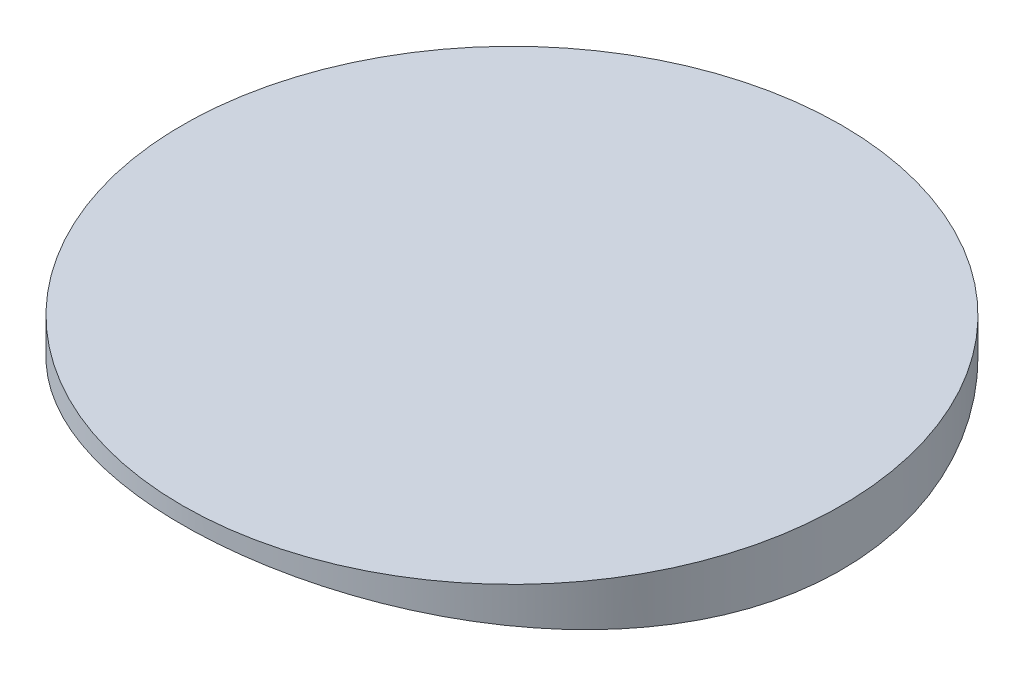
ISO-10303-21;
HEADER;
FILE_DESCRIPTION(('STEP AP214'),'2;1');
FILE_NAME('part.step','',(''),(''),'','','');
FILE_SCHEMA(('AUTOMOTIVE_DESIGN { 1 0 10303 214 1 1 1 1 }'));
ENDSEC;
DATA;
#1=APPLICATION_CONTEXT('core data for automotive mechanical design processes');
#2=APPLICATION_PROTOCOL_DEFINITION('international standard','automotive_design',2000,#1);
#3=PRODUCT_CONTEXT('',#1,'mechanical');
#4=PRODUCT('Part','Part','',(#3));
#5=PRODUCT_RELATED_PRODUCT_CATEGORY('part','',(#4));
#6=PRODUCT_DEFINITION_FORMATION('','',#4);
#7=PRODUCT_DEFINITION_CONTEXT('part definition',#1,'design');
#8=PRODUCT_DEFINITION('design','',#6,#7);
#9=PRODUCT_DEFINITION_SHAPE('','',#8);
#10=(LENGTH_UNIT() NAMED_UNIT(*) SI_UNIT(.MILLI.,.METRE.));
#11=(NAMED_UNIT(*) PLANE_ANGLE_UNIT() SI_UNIT($,.RADIAN.));
#12=(NAMED_UNIT(*) SI_UNIT($,.STERADIAN.) SOLID_ANGLE_UNIT());
#13=UNCERTAINTY_MEASURE_WITH_UNIT(LENGTH_MEASURE(1.E-05),#10,'distance_accuracy_value','');
#14=(GEOMETRIC_REPRESENTATION_CONTEXT(3) GLOBAL_UNCERTAINTY_ASSIGNED_CONTEXT((#13)) GLOBAL_UNIT_ASSIGNED_CONTEXT((#10,
#11,#12)) REPRESENTATION_CONTEXT('',''));
#15=CARTESIAN_POINT('',(0.,0.,0.));
#16=DIRECTION('',(0.,0.,1.));
#17=DIRECTION('',(1.,0.,0.));
#18=AXIS2_PLACEMENT_3D('',#15,#16,#17);
#19=CARTESIAN_POINT('',(0.,3.,0.));
#20=DIRECTION('',(0.,-1.,0.));
#21=DIRECTION('',(0.,0.,-1.));
#22=AXIS2_PLACEMENT_3D('',#19,#20,#21);
#23=CYLINDRICAL_SURFACE('',#22,17.75);
#24=CARTESIAN_POINT('',(0.,3.,0.));
#25=DIRECTION('',(0.,1.,0.));
#26=DIRECTION('',(0.,0.,1.));
#27=AXIS2_PLACEMENT_3D('',#24,#25,#26);
#28=CIRCLE('',#27,17.75);
#29=CARTESIAN_POINT('',(0.,3.,17.75));
#30=VERTEX_POINT('',#29);
#31=EDGE_CURVE('E10',#30,#30,#28,.T.);
#32=ORIENTED_EDGE('',*,*,#31,.F.);
#33=EDGE_LOOP('',(#32));
#34=FACE_BOUND('',#33,.T.);
#35=CARTESIAN_POINT('',(0.,2.09900340000001,-17.75));
#36=CARTESIAN_POINT('',(-0.491433900149807,2.09900216764836,-17.7499976735267));
#37=CARTESIAN_POINT('',(-0.982916530020127,2.09423107636766,-17.7295736278928));
#38=CARTESIAN_POINT('',(-1.96234996583072,2.07527570058066,-17.6480380111809));
#39=CARTESIAN_POINT('',(-2.45030028998495,2.06109015557167,-17.5869209917107));
#40=CARTESIAN_POINT('',(-3.41940177394618,2.02368989482152,-17.4244571266966));
#41=CARTESIAN_POINT('',(-3.90054879720632,2.00046991159636,-17.3230868109586));
#42=CARTESIAN_POINT('',(-4.85231153464607,1.94564459455475,-17.0809454528712));
#43=CARTESIAN_POINT('',(-5.32292757383714,1.91403951991046,-16.9401756283017));
#44=CARTESIAN_POINT('',(-6.24985270312643,1.84335168829396,-16.6205269411813));
#45=CARTESIAN_POINT('',(-6.70617729663108,1.80427738582975,-16.4416911402271));
#46=CARTESIAN_POINT('',(-7.60198717767945,1.71968899852689,-16.0471750969346));
#47=CARTESIAN_POINT('',(-8.04147235305884,1.6741748708032,-15.8314946092328));
#48=CARTESIAN_POINT('',(-8.90068545174085,1.57793364867855,-15.3648719887984));
#49=CARTESIAN_POINT('',(-9.32041393782313,1.52720670289864,-15.1139308612962));
#50=CARTESIAN_POINT('',(-10.1374139203251,1.42189460263339,-14.5785418387483));
#51=CARTESIAN_POINT('',(-10.5346851530274,1.36730940285718,-14.2940935503459));
#52=CARTESIAN_POINT('',(-11.3104852629579,1.2548274918673,-13.6887331865767));
#53=CARTESIAN_POINT('',(-11.6886049550004,1.19689139622589,-13.3673039297935));
#54=CARTESIAN_POINT('',(-12.4165458544308,1.08012824461524,-12.6940027230726));
#55=CARTESIAN_POINT('',(-12.7663667635571,1.02130117926317,-12.3421304523543));
#56=CARTESIAN_POINT('',(-13.4354239092553,0.904375385511255,-11.6102424058781));
#57=CARTESIAN_POINT('',(-13.7546572246536,0.846276727135264,-11.2302239482378));
#58=CARTESIAN_POINT('',(-14.3603444028004,0.732432965927232,-10.4445697875346));
#59=CARTESIAN_POINT('',(-14.6467981131199,0.676687874040308,-10.0389339653616));
#60=CARTESIAN_POINT('',(-15.188367787763,0.568439107945737,-9.19938497248016));
#61=CARTESIAN_POINT('',(-15.4430370092412,0.51598589868933,-8.76517691917405));
#62=CARTESIAN_POINT('',(-15.9148148725485,0.416654611871211,-7.87619097411225));
#63=CARTESIAN_POINT('',(-16.1319231064494,0.369776594860179,-7.42141285902461));
#64=CARTESIAN_POINT('',(-16.5268708929953,0.283008692213464,-6.49451953898693));
#65=CARTESIAN_POINT('',(-16.7047146407065,0.243118060131117,-6.0224061924467));
#66=CARTESIAN_POINT('',(-17.0197180237242,0.171540883470517,-5.06419118740278));
#67=CARTESIAN_POINT('',(-17.1568784989862,0.139854169514145,-4.57808981792613));
#68=CARTESIAN_POINT('',(-17.3873182193572,0.0861475192261473,-3.60411964396003));
#69=CARTESIAN_POINT('',(-17.4813264012814,0.0639674568930192,-3.11643209307797));
#70=CARTESIAN_POINT('',(-17.6281750476379,0.0291537101444027,-2.1345590522743));
#71=CARTESIAN_POINT('',(-17.6810159490135,0.0165199244062199,-1.64037363137671));
#72=CARTESIAN_POINT('',(-17.7450728039905,0.00118903335769042,-0.64921927293159));
#73=CARTESIAN_POINT('',(-17.7562938720456,-0.0015092928714472,-0.152250684910939));
#74=CARTESIAN_POINT('',(-17.7370275045556,0.00311107910149189,0.840827229290685));
#75=CARTESIAN_POINT('',(-17.7065405630266,0.0104296586570035,1.33693656557949));
#76=CARTESIAN_POINT('',(-17.6051967988499,0.0346007455670888,2.31427032458148));
#77=CARTESIAN_POINT('',(-17.5351978449678,0.0512506029542355,2.79558902086399));
#78=CARTESIAN_POINT('',(-17.356047717212,0.0934435532081054,3.75047721159731));
#79=CARTESIAN_POINT('',(-17.2468971714127,0.11898650341059,4.22404683023233));
#80=CARTESIAN_POINT('',(-16.990306447618,0.178224205932272,5.16018933207915));
#81=CARTESIAN_POINT('',(-16.842864616146,0.211919310269738,5.62276173947267));
#82=CARTESIAN_POINT('',(-16.5108254212522,0.286496085513679,6.5337739878395));
#83=CARTESIAN_POINT('',(-16.3262275436187,0.327377855877206,6.98221363312667));
#84=CARTESIAN_POINT('',(-15.9194321636609,0.415569784932033,7.86593267265295));
#85=CARTESIAN_POINT('',(-15.6969140546285,0.462934016390518,8.30105905479601));
#86=CARTESIAN_POINT('',(-15.2170464414502,0.562476437364064,9.15107681583447));
#87=CARTESIAN_POINT('',(-14.9596968203912,0.614654643037208,9.56596812680379));
#88=CARTESIAN_POINT('',(-14.4119082445781,0.722391963270564,10.3729088704726));
#89=CARTESIAN_POINT('',(-14.1214650291084,0.777951512740167,10.7649553521159));
#90=CARTESIAN_POINT('',(-13.5094502159222,0.890935946806646,11.5236633292259));
#91=CARTESIAN_POINT('',(-13.1878780984807,0.948360862536842,11.8903244006851));
#92=CARTESIAN_POINT('',(-12.5073761983231,1.06495839345886,12.6046557214652));
#93=CARTESIAN_POINT('',(-12.1477194799853,1.12413912269436,12.9516325283418));
#94=CARTESIAN_POINT('',(-11.4003136925216,1.24118503667594,13.614137434276));
#95=CARTESIAN_POINT('',(-11.0125641455423,1.29905019902247,13.9296649981712));
#96=CARTESIAN_POINT('',(-10.21154636885,1.4118529634241,14.5270940034082));
#97=CARTESIAN_POINT('',(-9.79827734449714,1.46679047421699,14.8089943968458));
#98=CARTESIAN_POINT('',(-8.94900716528595,1.57220189285851,15.3371384149977));
#99=CARTESIAN_POINT('',(-8.51300613769362,1.6226758256924,15.5833822393074));
#100=CARTESIAN_POINT('',(-7.62003411678745,1.71787294989165,16.0389992956327));
#101=CARTESIAN_POINT('',(-7.16300958467495,1.76258021447601,16.2482709801026));
#102=CARTESIAN_POINT('',(-6.23229289030544,1.84481241094844,16.6274932179164));
#103=CARTESIAN_POINT('',(-5.75860065038419,1.88233730936459,16.7974435880123));
#104=CARTESIAN_POINT('',(-4.79802252990442,1.94912333554688,17.0966223681426));
#105=CARTESIAN_POINT('',(-4.3111384407196,1.97838557922897,17.2258562774271));
#106=CARTESIAN_POINT('',(-3.32770801065407,2.02780529153385,17.4425446792502));
#107=CARTESIAN_POINT('',(-2.83116187559363,2.04796295388086,17.5300000607406));
#108=CARTESIAN_POINT('',(-1.84336341113391,2.07824287060055,17.6608928087894));
#109=CARTESIAN_POINT('',(-1.35224264681857,2.08858034118735,17.7052746569209));
#110=CARTESIAN_POINT('',(-0.367906250349285,2.09970567450912,17.7530260323656));
#111=CARTESIAN_POINT('',(0.125309350362291,2.10049368007329,17.7563961730815));
#112=CARTESIAN_POINT('',(1.11019580690158,2.09249834282815,17.7220976930214));
#113=CARTESIAN_POINT('',(1.60186677134417,2.08371568882763,17.6844320256287));
#114=CARTESIAN_POINT('',(2.58011896674844,2.05682623914264,17.5683833979145));
#115=CARTESIAN_POINT('',(3.06670021371209,2.03871947278199,17.4900005656463));
#116=CARTESIAN_POINT('',(4.0251400500618,1.99397362641447,17.2944189414568));
#117=CARTESIAN_POINT('',(4.49710712575665,1.96744578635822,17.1777255691075));
#118=CARTESIAN_POINT('',(5.4294091578802,1.90651129474908,16.906204287508));
#119=CARTESIAN_POINT('',(5.88974424324669,1.87210473057252,16.7513768011699));
#120=CARTESIAN_POINT('',(6.7957169196328,1.79633120484515,16.4047549860318));
#121=CARTESIAN_POINT('',(7.24135350220204,1.75496376689853,16.2129581269511));
#122=CARTESIAN_POINT('',(8.11497297605027,1.6663676415048,15.7938104867917));
#123=CARTESIAN_POINT('',(8.54295557626,1.61913885747044,15.5664591198056));
#124=CARTESIAN_POINT('',(9.38514951868315,1.51927647263005,15.0739244720486));
#125=CARTESIAN_POINT('',(9.79903441217586,1.46656897678928,14.8081979374125));
#126=CARTESIAN_POINT('',(10.6030483685396,1.35781156242898,14.2435665220657));
#127=CARTESIAN_POINT('',(10.9931772223102,1.30176161449779,13.9446613493822));
#128=CARTESIAN_POINT('',(11.7472128682115,1.18782187710542,13.3156515346542));
#129=CARTESIAN_POINT('',(12.1111162400325,1.12993184907588,12.9855428359979));
#130=CARTESIAN_POINT('',(12.8102991608037,1.01388091999327,12.2963292153186));
#131=CARTESIAN_POINT('',(13.1455783558417,0.955720015600431,11.9372239348858));
#132=CARTESIAN_POINT('',(13.7921001971144,0.839488085783322,11.1844451621414));
#133=CARTESIAN_POINT('',(14.1026834068092,0.78144505044432,10.7902006380142));
#134=CARTESIAN_POINT('',(14.6895477762945,0.668384815466029,9.97653775535923));
#135=CARTESIAN_POINT('',(14.9658283938089,0.613367663669389,9.55711899901743));
#136=CARTESIAN_POINT('',(15.4820822352393,0.507959686318647,8.69595576459424));
#137=CARTESIAN_POINT('',(15.7220563935648,0.45756874171423,8.25421186147959));
#138=CARTESIAN_POINT('',(16.1638964262227,0.36290277943039,7.35142855391276));
#139=CARTESIAN_POINT('',(16.3657627809909,0.318627684648636,6.8903893928108));
#140=CARTESIAN_POINT('',(16.7287252351005,0.237767825572588,5.95503282114152));
#141=CARTESIAN_POINT('',(16.8900554647576,0.201139115127992,5.48081009995816));
#142=CARTESIAN_POINT('',(17.1721833857345,0.136356279049456,4.51988410054988));
#143=CARTESIAN_POINT('',(17.2929811454144,0.108202139122733,4.03318084337549));
#144=CARTESIAN_POINT('',(17.4930113174778,0.0612415841082216,3.05093719476239));
#145=CARTESIAN_POINT('',(17.572250206947,0.0424337123980309,2.55539819285864));
#146=CARTESIAN_POINT('',(17.6885033907786,0.0147479030372739,1.55911948495265));
#147=CARTESIAN_POINT('',(17.7255185440558,0.00586976339631195,1.05837988494999));
#148=CARTESIAN_POINT('',(17.7566096827731,-0.00158414836056286,0.0680002453408129));
#149=CARTESIAN_POINT('',(17.7517330209047,-0.000411212940113321,-0.421605333218729));
#150=CARTESIAN_POINT('',(17.7015713947466,0.011603902631987,-1.39861608502385));
#151=CARTESIAN_POINT('',(17.65628714041,0.0224459128999618,-1.88602129677821));
#152=CARTESIAN_POINT('',(17.5256906065704,0.0534742744249739,-2.85512221621754));
#153=CARTESIAN_POINT('',(17.4403791940696,0.0736604232845624,-3.33681804733802));
#154=CARTESIAN_POINT('',(17.230427151024,0.122778146339296,-4.29110351630284));
#155=CARTESIAN_POINT('',(17.1057863311795,0.15170976262794,-4.76369311030559));
#156=CARTESIAN_POINT('',(16.8188197172087,0.21732216390994,-5.69437120773332));
#157=CARTESIAN_POINT('',(16.6566672307082,0.253967243839655,-6.15251571286307));
#158=CARTESIAN_POINT('',(16.2956044301554,0.334038495533592,-7.05345991897133));
#159=CARTESIAN_POINT('',(16.0966943275606,0.377464628287877,-7.49625970820678));
#160=CARTESIAN_POINT('',(15.6635441612796,0.469886288781137,-8.36366624164178));
#161=CARTESIAN_POINT('',(15.4293008450174,0.518882329151955,-8.78827130631227));
#162=CARTESIAN_POINT('',(14.9271309592756,0.621093888186533,-9.61653915486157));
#163=CARTESIAN_POINT('',(14.6592037632087,0.674309485335658,-10.0202015489676));
#164=CARTESIAN_POINT('',(14.0849646020243,0.784771918044543,-10.8130148917668));
#165=CARTESIAN_POINT('',(13.7779146972195,0.84208312749563,-11.2016225609558));
#166=CARTESIAN_POINT('',(13.1325365770956,0.958018474852267,-11.9517273524588));
#167=CARTESIAN_POINT('',(12.7942078516191,1.01664263416021,-12.3132240324185));
#168=CARTESIAN_POINT('',(12.088436692289,1.1336002337676,-13.0068075732621));
#169=CARTESIAN_POINT('',(11.7209876163993,1.19193360449772,-13.3388876877556));
#170=CARTESIAN_POINT('',(10.9594552369247,1.30669614572551,-13.9713212454821));
#171=CARTESIAN_POINT('',(10.5653720218723,1.36312532255183,-14.2716747941665));
#172=CARTESIAN_POINT('',(9.74696249517249,1.47336828148824,-14.8429112930486));
#173=CARTESIAN_POINT('',(9.32226714495374,1.52712917905827,-15.1132760663605));
#174=CARTESIAN_POINT('',(8.45095809218343,1.62957721338171,-15.6172049690815));
#175=CARTESIAN_POINT('',(8.00434331055424,1.67826409997599,-15.8507672843444));
#176=CARTESIAN_POINT('',(7.09265224112043,1.76914257947258,-16.2791366280451));
#177=CARTESIAN_POINT('',(6.62758920287631,1.81133873147182,-16.473970887469));
#178=CARTESIAN_POINT('',(5.68205551433043,1.88806109421088,-16.823516209351));
#179=CARTESIAN_POINT('',(5.20158743876291,1.92258857909163,-16.9782339378445));
#180=CARTESIAN_POINT('',(4.3322479882188,1.97655923845075,-17.2177812182359));
#181=CARTESIAN_POINT('',(3.94562436296509,1.99764875438317,-17.3104761158584));
#182=CARTESIAN_POINT('',(3.16666189633854,2.03408911803444,-17.4697680488959));
#183=CARTESIAN_POINT('',(2.7743218190225,2.0494387050157,-17.5363593509826));
#184=CARTESIAN_POINT('',(1.98588440500417,2.07410979182208,-17.6430442355629));
#185=CARTESIAN_POINT('',(1.58978723751049,2.08343156182717,-17.6831390056907));
#186=CARTESIAN_POINT('',(0.795803739747293,2.09587814900139,-17.7366147439607));
#187=CARTESIAN_POINT('',(0.397917844125648,2.09900439784471,-17.7500018837635));
#188=CARTESIAN_POINT('',(0.,2.09900340000001,-17.75));
#189=B_SPLINE_CURVE_WITH_KNOTS('',3,(#35,#36,#37,#38,#39,#40,#41,#42,#43,#44,#45,#46,#47,#48,
#49,#50,#51,#52,#53,#54,#55,#56,#57,#58,#59,#60,#61,#62,#63,#64,#65,#66,#67,#68,#69,#70,#71,#72,
#73,#74,#75,#76,#77,#78,#79,#80,#81,#82,#83,#84,#85,#86,#87,#88,#89,#90,#91,#92,#93,#94,#95,#96,
#97,#98,#99,#100,#101,#102,#103,#104,#105,#106,#107,#108,#109,#110,#111,#112,#113,#114,#115,
#116,#117,#118,#119,#120,#121,#122,#123,#124,#125,#126,#127,#128,#129,#130,#131,#132,#133,#134,
#135,#136,#137,#138,#139,#140,#141,#142,#143,#144,#145,#146,#147,#148,#149,#150,#151,#152,#153,
#154,#155,#156,#157,#158,#159,#160,#161,#162,#163,#164,#165,#166,#167,#168,#169,#170,#171,#172,
#173,#174,#175,#176,#177,#178,#179,#180,#181,#182,#183,#184,#185,#186,#187,#188),.UNSPECIFIED.,
.T.,.F.,(4,2,2,2,2,2,2,2,2,2,2,2,2,2,2,2,2,2,2,2,2,2,2,2,2,2,2,2,2,2,2,2,2,2,2,2,2,2,2,2,2,2,2,
2,2,2,2,2,2,2,2,2,2,2,2,2,2,2,2,2,2,2,2,2,2,2,2,2,2,2,2,2,2,2,2,2,4),(0.,1.473940145113,
2.9480776761258,4.42307598672803,5.89802871237735,7.37132170292138,8.84462450509853,
10.3178853140425,11.7911634200262,13.2883691439851,14.7855906460464,16.282954993403,
17.780326303394,19.2968131176029,20.8133164004684,22.3296575797549,23.8459674501602,
25.3356246649108,26.8252660684494,28.3147244113163,29.8041651122496,31.2624471302916,
32.7207057554474,34.1790273609292,35.6373691498711,37.1087153451423,38.5800664791597,
40.0516072603706,41.5231726145111,43.0311123151743,44.5390776716185,46.0470900076487,
47.5550939019232,49.0671773738913,50.5792678924408,52.0911540972537,53.6030081311437,
55.0809076595008,56.5587850832213,58.0365561498296,59.5143225689587,60.9733280716278,
62.4323173944739,63.8914066098533,65.3505198722933,66.8327950483591,68.3150832695172,
69.7975644611655,71.2800639797059,72.7939604629123,74.3078808756612,75.8217623184192,
77.3356246739782,78.8405310744142,80.3454349367369,81.8501041851306,83.3547428250181,
84.821875058612,86.2889815154991,87.7560561958123,89.2231379375308,90.6835724023283,
92.1439984658702,93.6045590501255,95.0651468077399,96.5591502726976,98.0531781091495,
99.5475477033766,101.041912330526,102.559023430286,104.076209291381,105.592324565336,
107.108187749584,108.301715926331,109.495506099922,110.689242761515,111.882703539729),.UNSPECIFIED.);
#190=CARTESIAN_POINT('',(0.,2.09900340000001,-17.75));
#191=VERTEX_POINT('',#190);
#192=EDGE_CURVE('E39',#191,#191,#189,.T.);
#193=ORIENTED_EDGE('',*,*,#192,.T.);
#194=EDGE_LOOP('',(#193));
#195=FACE_BOUND('',#194,.T.);
#196=ADVANCED_FACE('F32',(#34,#195),#23,.T.);
#197=CARTESIAN_POINT('',(0.,3.,0.));
#198=DIRECTION('',(0.,1.,0.));
#199=DIRECTION('',(0.,0.,1.));
#200=AXIS2_PLACEMENT_3D('',#197,#198,#199);
#201=PLANE('',#200);
#202=ORIENTED_EDGE('',*,*,#31,.T.);
#203=EDGE_LOOP('',(#202));
#204=FACE_BOUND('',#203,.T.);
#205=ADVANCED_FACE('F52',(#204),#201,.T.);
#206=CARTESIAN_POINT('',(0.,-74.0009960743247,-17.75));
#207=DIRECTION('',(0.,0.,1.));
#208=DIRECTION('',(1.,0.,0.));
#209=AXIS2_PLACEMENT_3D('',#206,#207,#208);
#210=CYLINDRICAL_SURFACE('',#209,76.0999994743247);
#211=ORIENTED_EDGE('',*,*,#192,.F.);
#212=EDGE_LOOP('',(#211));
#213=FACE_BOUND('',#212,.T.);
#214=ADVANCED_FACE('F49',(#213),#210,.F.);
#215=CLOSED_SHELL('',(#196,#205,#214));
#216=MANIFOLD_SOLID_BREP('B2',#215);
#217=ADVANCED_BREP_SHAPE_REPRESENTATION('',(#18,#216),#14);
#218=SHAPE_DEFINITION_REPRESENTATION(#9,#217);
ENDSEC;
END-ISO-10303-21;
